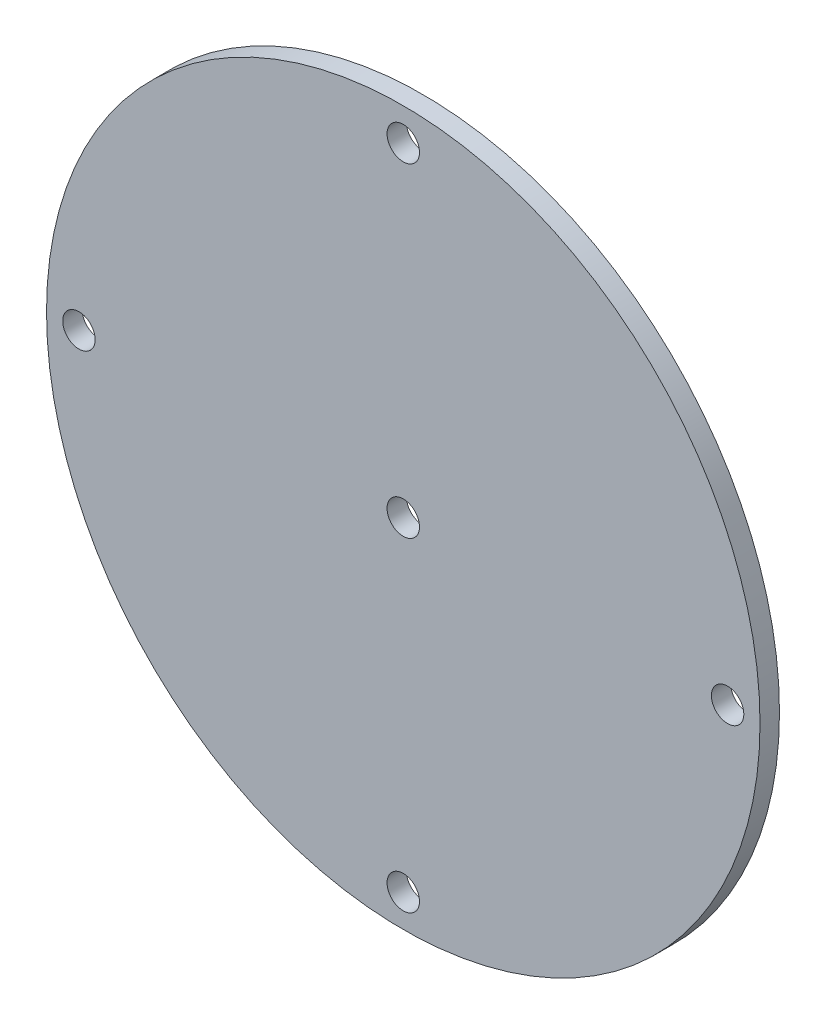
ISO-10303-21;
HEADER;
FILE_DESCRIPTION(('STEP AP214'),'2;1');
FILE_NAME('part.step','',(''),(''),'','','');
FILE_SCHEMA(('AUTOMOTIVE_DESIGN { 1 0 10303 214 1 1 1 1 }'));
ENDSEC;
DATA;
#1=APPLICATION_CONTEXT('core data for automotive mechanical design processes');
#2=APPLICATION_PROTOCOL_DEFINITION('international standard','automotive_design',2000,#1);
#3=PRODUCT_CONTEXT('',#1,'mechanical');
#4=PRODUCT('Part','Part','',(#3));
#5=PRODUCT_RELATED_PRODUCT_CATEGORY('part','',(#4));
#6=PRODUCT_DEFINITION_FORMATION('','',#4);
#7=PRODUCT_DEFINITION_CONTEXT('part definition',#1,'design');
#8=PRODUCT_DEFINITION('design','',#6,#7);
#9=PRODUCT_DEFINITION_SHAPE('','',#8);
#10=(LENGTH_UNIT() NAMED_UNIT(*) SI_UNIT(.MILLI.,.METRE.));
#11=(NAMED_UNIT(*) PLANE_ANGLE_UNIT() SI_UNIT($,.RADIAN.));
#12=(NAMED_UNIT(*) SI_UNIT($,.STERADIAN.) SOLID_ANGLE_UNIT());
#13=UNCERTAINTY_MEASURE_WITH_UNIT(LENGTH_MEASURE(1.E-05),#10,'distance_accuracy_value','');
#14=(GEOMETRIC_REPRESENTATION_CONTEXT(3) GLOBAL_UNCERTAINTY_ASSIGNED_CONTEXT((#13)) GLOBAL_UNIT_ASSIGNED_CONTEXT((#10,
#11,#12)) REPRESENTATION_CONTEXT('',''));
#15=CARTESIAN_POINT('',(0.,0.,0.));
#16=DIRECTION('',(0.,0.,1.));
#17=DIRECTION('',(1.,0.,0.));
#18=AXIS2_PLACEMENT_3D('',#15,#16,#17);
#19=CARTESIAN_POINT('',(0.,0.,3.));
#20=DIRECTION('',(0.,0.,1.));
#21=DIRECTION('',(1.,0.,0.));
#22=AXIS2_PLACEMENT_3D('',#19,#20,#21);
#23=PLANE('',#22);
#24=CARTESIAN_POINT('',(50.,0.,3.));
#25=DIRECTION('',(0.,0.,-1.));
#26=DIRECTION('',(-1.,0.,0.));
#27=AXIS2_PLACEMENT_3D('',#24,#25,#26);
#28=CIRCLE('',#27,2.5);
#29=CARTESIAN_POINT('',(52.5,0.,3.));
#30=VERTEX_POINT('',#29);
#31=EDGE_CURVE('E112',#30,#30,#28,.T.);
#32=ORIENTED_EDGE('',*,*,#31,.T.);
#33=EDGE_LOOP('',(#32));
#34=FACE_BOUND('',#33,.T.);
#35=CARTESIAN_POINT('',(0.,50.,3.));
#36=DIRECTION('',(0.,0.,-1.));
#37=DIRECTION('',(-1.,0.,0.));
#38=AXIS2_PLACEMENT_3D('',#35,#36,#37);
#39=CIRCLE('',#38,2.5);
#40=CARTESIAN_POINT('',(2.5,50.,3.));
#41=VERTEX_POINT('',#40);
#42=EDGE_CURVE('E139',#41,#41,#39,.T.);
#43=ORIENTED_EDGE('',*,*,#42,.T.);
#44=EDGE_LOOP('',(#43));
#45=FACE_BOUND('',#44,.T.);
#46=CARTESIAN_POINT('',(-50.,0.,3.));
#47=DIRECTION('',(0.,0.,-1.));
#48=DIRECTION('',(-1.,0.,0.));
#49=AXIS2_PLACEMENT_3D('',#46,#47,#48);
#50=CIRCLE('',#49,2.5);
#51=CARTESIAN_POINT('',(-47.5,0.,3.));
#52=VERTEX_POINT('',#51);
#53=EDGE_CURVE('E124',#52,#52,#50,.T.);
#54=ORIENTED_EDGE('',*,*,#53,.T.);
#55=EDGE_LOOP('',(#54));
#56=FACE_BOUND('',#55,.T.);
#57=CARTESIAN_POINT('',(0.,-50.,3.));
#58=DIRECTION('',(0.,0.,-1.));
#59=DIRECTION('',(-1.,0.,0.));
#60=AXIS2_PLACEMENT_3D('',#57,#58,#59);
#61=CIRCLE('',#60,2.5);
#62=CARTESIAN_POINT('',(2.5,-50.,3.));
#63=VERTEX_POINT('',#62);
#64=EDGE_CURVE('E94',#63,#63,#61,.T.);
#65=ORIENTED_EDGE('',*,*,#64,.T.);
#66=EDGE_LOOP('',(#65));
#67=FACE_BOUND('',#66,.T.);
#68=CARTESIAN_POINT('',(0.,0.,3.));
#69=DIRECTION('',(0.,0.,-1.));
#70=DIRECTION('',(-1.,0.,0.));
#71=AXIS2_PLACEMENT_3D('',#68,#69,#70);
#72=CIRCLE('',#71,2.5);
#73=CARTESIAN_POINT('',(2.5,0.,3.));
#74=VERTEX_POINT('',#73);
#75=EDGE_CURVE('E102',#74,#74,#72,.T.);
#76=ORIENTED_EDGE('',*,*,#75,.T.);
#77=EDGE_LOOP('',(#76));
#78=FACE_BOUND('',#77,.T.);
#79=CARTESIAN_POINT('',(0.,0.,3.));
#80=DIRECTION('',(0.,0.,-1.));
#81=DIRECTION('',(1.,0.,0.));
#82=AXIS2_PLACEMENT_3D('',#79,#80,#81);
#83=CIRCLE('',#82,55.);
#84=CARTESIAN_POINT('',(-55.,0.,3.));
#85=VERTEX_POINT('',#84);
#86=EDGE_CURVE('E114',#85,#85,#83,.T.);
#87=ORIENTED_EDGE('',*,*,#86,.F.);
#88=EDGE_LOOP('',(#87));
#89=FACE_BOUND('',#88,.T.);
#90=ADVANCED_FACE('F17',(#34,#45,#56,#67,#78,#89),#23,.T.);
#91=CARTESIAN_POINT('',(0.,0.,0.));
#92=DIRECTION('',(0.,0.,1.));
#93=DIRECTION('',(1.,0.,0.));
#94=AXIS2_PLACEMENT_3D('',#91,#92,#93);
#95=PLANE('',#94);
#96=CARTESIAN_POINT('',(50.,0.,0.));
#97=DIRECTION('',(0.,0.,-1.));
#98=DIRECTION('',(-1.,0.,0.));
#99=AXIS2_PLACEMENT_3D('',#96,#97,#98);
#100=CIRCLE('',#99,2.5);
#101=CARTESIAN_POINT('',(52.5,0.,0.));
#102=VERTEX_POINT('',#101);
#103=EDGE_CURVE('E106',#102,#102,#100,.T.);
#104=ORIENTED_EDGE('',*,*,#103,.F.);
#105=EDGE_LOOP('',(#104));
#106=FACE_BOUND('',#105,.T.);
#107=CARTESIAN_POINT('',(0.,50.,0.));
#108=DIRECTION('',(0.,0.,-1.));
#109=DIRECTION('',(-1.,0.,0.));
#110=AXIS2_PLACEMENT_3D('',#107,#108,#109);
#111=CIRCLE('',#110,2.5);
#112=CARTESIAN_POINT('',(2.5,50.,0.));
#113=VERTEX_POINT('',#112);
#114=EDGE_CURVE('E152',#113,#113,#111,.T.);
#115=ORIENTED_EDGE('',*,*,#114,.F.);
#116=EDGE_LOOP('',(#115));
#117=FACE_BOUND('',#116,.T.);
#118=CARTESIAN_POINT('',(-50.,0.,0.));
#119=DIRECTION('',(0.,0.,-1.));
#120=DIRECTION('',(-1.,0.,0.));
#121=AXIS2_PLACEMENT_3D('',#118,#119,#120);
#122=CIRCLE('',#121,2.5);
#123=CARTESIAN_POINT('',(-47.5,0.,0.));
#124=VERTEX_POINT('',#123);
#125=EDGE_CURVE('E123',#124,#124,#122,.T.);
#126=ORIENTED_EDGE('',*,*,#125,.F.);
#127=EDGE_LOOP('',(#126));
#128=FACE_BOUND('',#127,.T.);
#129=CARTESIAN_POINT('',(0.,-50.,0.));
#130=DIRECTION('',(0.,0.,-1.));
#131=DIRECTION('',(-1.,0.,0.));
#132=AXIS2_PLACEMENT_3D('',#129,#130,#131);
#133=CIRCLE('',#132,2.5);
#134=CARTESIAN_POINT('',(2.5,-50.,0.));
#135=VERTEX_POINT('',#134);
#136=EDGE_CURVE('E125',#135,#135,#133,.T.);
#137=ORIENTED_EDGE('',*,*,#136,.F.);
#138=EDGE_LOOP('',(#137));
#139=FACE_BOUND('',#138,.T.);
#140=CARTESIAN_POINT('',(0.,0.,0.));
#141=DIRECTION('',(0.,0.,-1.));
#142=DIRECTION('',(-1.,0.,0.));
#143=AXIS2_PLACEMENT_3D('',#140,#141,#142);
#144=CIRCLE('',#143,2.5);
#145=CARTESIAN_POINT('',(2.5,0.,0.));
#146=VERTEX_POINT('',#145);
#147=EDGE_CURVE('E87',#146,#146,#144,.T.);
#148=ORIENTED_EDGE('',*,*,#147,.F.);
#149=EDGE_LOOP('',(#148));
#150=FACE_BOUND('',#149,.T.);
#151=CARTESIAN_POINT('',(0.,0.,0.));
#152=DIRECTION('',(0.,0.,1.));
#153=DIRECTION('',(1.,0.,0.));
#154=AXIS2_PLACEMENT_3D('',#151,#152,#153);
#155=CIRCLE('',#154,55.);
#156=CARTESIAN_POINT('',(-55.,0.,0.));
#157=VERTEX_POINT('',#156);
#158=EDGE_CURVE('E11',#157,#157,#155,.T.);
#159=ORIENTED_EDGE('',*,*,#158,.F.);
#160=EDGE_LOOP('',(#159));
#161=FACE_BOUND('',#160,.T.);
#162=ADVANCED_FACE('F208',(#106,#117,#128,#139,#150,#161),#95,.F.);
#163=CARTESIAN_POINT('',(0.,0.,0.));
#164=DIRECTION('',(0.,0.,1.));
#165=DIRECTION('',(1.,0.,0.));
#166=AXIS2_PLACEMENT_3D('',#163,#164,#165);
#167=CYLINDRICAL_SURFACE('',#166,55.);
#168=ORIENTED_EDGE('',*,*,#86,.T.);
#169=DIRECTION('',(0.,0.,-1.));
#170=VECTOR('',#169,1.);
#171=CARTESIAN_POINT('',(-55.,0.,0.));
#172=LINE('',#171,#170);
#173=EDGE_CURVE('E28',#85,#157,#172,.T.);
#174=ORIENTED_EDGE('',*,*,#173,.T.);
#175=ORIENTED_EDGE('',*,*,#158,.T.);
#176=ORIENTED_EDGE('',*,*,#173,.F.);
#177=EDGE_LOOP('',(#168,#174,#175,#176));
#178=FACE_BOUND('',#177,.T.);
#179=ADVANCED_FACE('F202',(#178),#167,.T.);
#180=CARTESIAN_POINT('',(50.,0.,3.));
#181=DIRECTION('',(0.,0.,-1.));
#182=DIRECTION('',(-1.,0.,0.));
#183=AXIS2_PLACEMENT_3D('',#180,#181,#182);
#184=CYLINDRICAL_SURFACE('',#183,2.5);
#185=ORIENTED_EDGE('',*,*,#31,.F.);
#186=DIRECTION('',(0.,0.,-1.));
#187=VECTOR('',#186,1.);
#188=CARTESIAN_POINT('',(52.5,0.,3.));
#189=LINE('',#188,#187);
#190=EDGE_CURVE('E108',#30,#102,#189,.T.);
#191=ORIENTED_EDGE('',*,*,#190,.T.);
#192=ORIENTED_EDGE('',*,*,#103,.T.);
#193=ORIENTED_EDGE('',*,*,#190,.F.);
#194=EDGE_LOOP('',(#185,#191,#192,#193));
#195=FACE_BOUND('',#194,.T.);
#196=ADVANCED_FACE('F162',(#195),#184,.F.);
#197=CARTESIAN_POINT('',(0.,50.,3.));
#198=DIRECTION('',(0.,0.,-1.));
#199=DIRECTION('',(-1.,0.,0.));
#200=AXIS2_PLACEMENT_3D('',#197,#198,#199);
#201=CYLINDRICAL_SURFACE('',#200,2.5);
#202=ORIENTED_EDGE('',*,*,#42,.F.);
#203=DIRECTION('',(0.,0.,-1.));
#204=VECTOR('',#203,1.);
#205=CARTESIAN_POINT('',(2.5,50.,3.));
#206=LINE('',#205,#204);
#207=EDGE_CURVE('E145',#41,#113,#206,.T.);
#208=ORIENTED_EDGE('',*,*,#207,.T.);
#209=ORIENTED_EDGE('',*,*,#114,.T.);
#210=ORIENTED_EDGE('',*,*,#207,.F.);
#211=EDGE_LOOP('',(#202,#208,#209,#210));
#212=FACE_BOUND('',#211,.T.);
#213=ADVANCED_FACE('F239',(#212),#201,.F.);
#214=CARTESIAN_POINT('',(-50.,0.,3.));
#215=DIRECTION('',(0.,0.,-1.));
#216=DIRECTION('',(-1.,0.,0.));
#217=AXIS2_PLACEMENT_3D('',#214,#215,#216);
#218=CYLINDRICAL_SURFACE('',#217,2.5);
#219=ORIENTED_EDGE('',*,*,#53,.F.);
#220=DIRECTION('',(0.,0.,-1.));
#221=VECTOR('',#220,1.);
#222=CARTESIAN_POINT('',(-47.5,0.,3.));
#223=LINE('',#222,#221);
#224=EDGE_CURVE('E119',#52,#124,#223,.T.);
#225=ORIENTED_EDGE('',*,*,#224,.T.);
#226=ORIENTED_EDGE('',*,*,#125,.T.);
#227=ORIENTED_EDGE('',*,*,#224,.F.);
#228=EDGE_LOOP('',(#219,#225,#226,#227));
#229=FACE_BOUND('',#228,.T.);
#230=ADVANCED_FACE('F135',(#229),#218,.F.);
#231=CARTESIAN_POINT('',(0.,-50.,3.));
#232=DIRECTION('',(0.,0.,-1.));
#233=DIRECTION('',(-1.,0.,0.));
#234=AXIS2_PLACEMENT_3D('',#231,#232,#233);
#235=CYLINDRICAL_SURFACE('',#234,2.5);
#236=ORIENTED_EDGE('',*,*,#64,.F.);
#237=DIRECTION('',(0.,0.,-1.));
#238=VECTOR('',#237,1.);
#239=CARTESIAN_POINT('',(2.5,-50.,3.));
#240=LINE('',#239,#238);
#241=EDGE_CURVE('E21',#63,#135,#240,.T.);
#242=ORIENTED_EDGE('',*,*,#241,.T.);
#243=ORIENTED_EDGE('',*,*,#136,.T.);
#244=ORIENTED_EDGE('',*,*,#241,.F.);
#245=EDGE_LOOP('',(#236,#242,#243,#244));
#246=FACE_BOUND('',#245,.T.);
#247=ADVANCED_FACE('F19',(#246),#235,.F.);
#248=CARTESIAN_POINT('',(0.,0.,3.));
#249=DIRECTION('',(0.,0.,-1.));
#250=DIRECTION('',(-1.,0.,0.));
#251=AXIS2_PLACEMENT_3D('',#248,#249,#250);
#252=CYLINDRICAL_SURFACE('',#251,2.5);
#253=ORIENTED_EDGE('',*,*,#75,.F.);
#254=DIRECTION('',(0.,0.,-1.));
#255=VECTOR('',#254,1.);
#256=CARTESIAN_POINT('',(2.5,0.,3.));
#257=LINE('',#256,#255);
#258=EDGE_CURVE('E90',#74,#146,#257,.T.);
#259=ORIENTED_EDGE('',*,*,#258,.T.);
#260=ORIENTED_EDGE('',*,*,#147,.T.);
#261=ORIENTED_EDGE('',*,*,#258,.F.);
#262=EDGE_LOOP('',(#253,#259,#260,#261));
#263=FACE_BOUND('',#262,.T.);
#264=ADVANCED_FACE('F89',(#263),#252,.F.);
#265=CLOSED_SHELL('',(#90,#162,#179,#196,#213,#230,#247,#264));
#266=MANIFOLD_SOLID_BREP('B1',#265);
#267=ADVANCED_BREP_SHAPE_REPRESENTATION('',(#18,#266),#14);
#268=SHAPE_DEFINITION_REPRESENTATION(#9,#267);
ENDSEC;
END-ISO-10303-21;
